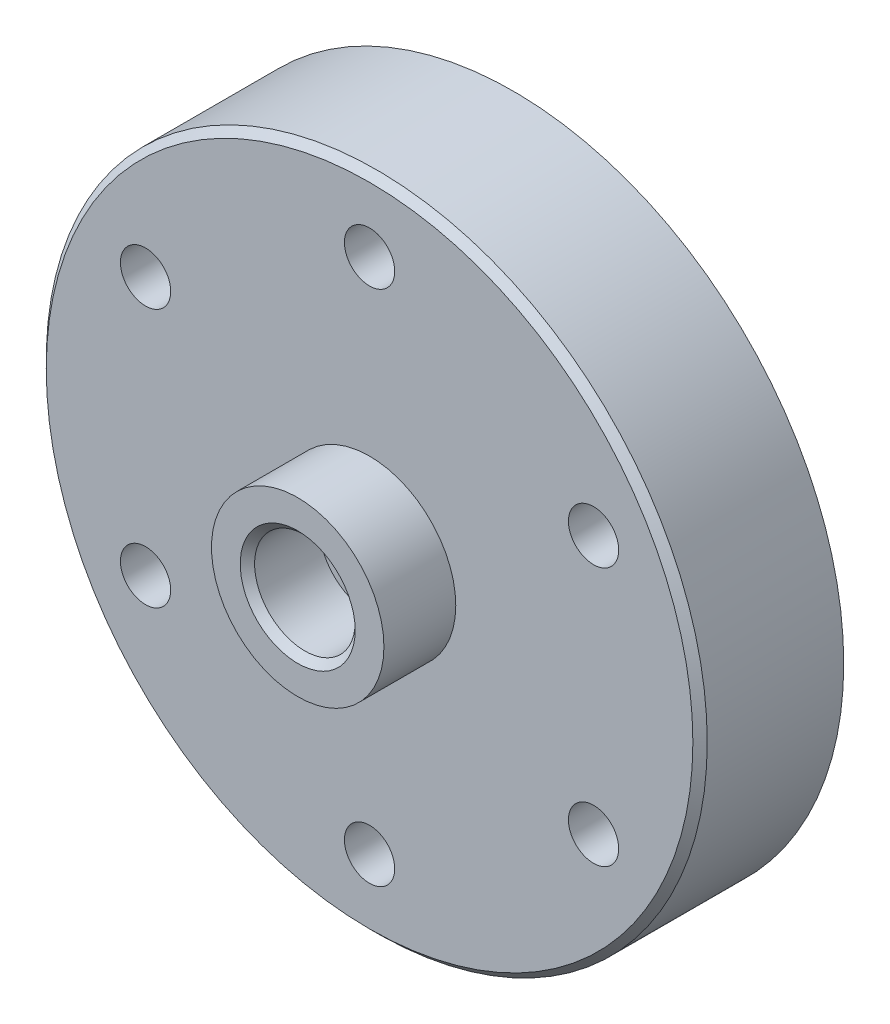
ISO-10303-21;
HEADER;
FILE_DESCRIPTION(('STEP AP214'),'2;1');
FILE_NAME('part.step','',(''),(''),'','','');
FILE_SCHEMA(('AUTOMOTIVE_DESIGN { 1 0 10303 214 1 1 1 1 }'));
ENDSEC;
DATA;
#1=APPLICATION_CONTEXT('core data for automotive mechanical design processes');
#2=APPLICATION_PROTOCOL_DEFINITION('international standard','automotive_design',2000,#1);
#3=PRODUCT_CONTEXT('',#1,'mechanical');
#4=PRODUCT('Part','Part','',(#3));
#5=PRODUCT_RELATED_PRODUCT_CATEGORY('part','',(#4));
#6=PRODUCT_DEFINITION_FORMATION('','',#4);
#7=PRODUCT_DEFINITION_CONTEXT('part definition',#1,'design');
#8=PRODUCT_DEFINITION('design','',#6,#7);
#9=PRODUCT_DEFINITION_SHAPE('','',#8);
#10=(LENGTH_UNIT() NAMED_UNIT(*) SI_UNIT(.MILLI.,.METRE.));
#11=(NAMED_UNIT(*) PLANE_ANGLE_UNIT() SI_UNIT($,.RADIAN.));
#12=(NAMED_UNIT(*) SI_UNIT($,.STERADIAN.) SOLID_ANGLE_UNIT());
#13=UNCERTAINTY_MEASURE_WITH_UNIT(LENGTH_MEASURE(1.E-05),#10,'distance_accuracy_value','');
#14=(GEOMETRIC_REPRESENTATION_CONTEXT(3) GLOBAL_UNCERTAINTY_ASSIGNED_CONTEXT((#13)) GLOBAL_UNIT_ASSIGNED_CONTEXT((#10,
#11,#12)) REPRESENTATION_CONTEXT('',''));
#15=CARTESIAN_POINT('',(0.,0.,0.));
#16=DIRECTION('',(0.,0.,1.));
#17=DIRECTION('',(1.,0.,0.));
#18=AXIS2_PLACEMENT_3D('',#15,#16,#17);
#19=CARTESIAN_POINT('',(0.,0.,20.));
#20=DIRECTION('',(0.,0.,1.));
#21=DIRECTION('',(1.,0.,0.));
#22=AXIS2_PLACEMENT_3D('',#19,#20,#21);
#23=PLANE('',#22);
#24=CARTESIAN_POINT('',(0.,0.,20.));
#25=DIRECTION('',(0.,0.,1.));
#26=DIRECTION('',(1.,0.,0.));
#27=AXIS2_PLACEMENT_3D('',#24,#25,#26);
#28=CIRCLE('',#27,12.);
#29=CARTESIAN_POINT('',(12.,0.,20.));
#30=VERTEX_POINT('',#29);
#31=EDGE_CURVE('E176',#30,#30,#28,.T.);
#32=ORIENTED_EDGE('',*,*,#31,.F.);
#33=EDGE_LOOP('',(#32));
#34=FACE_BOUND('',#33,.T.);
#35=CARTESIAN_POINT('',(0.,0.,20.));
#36=DIRECTION('',(0.,0.,1.));
#37=DIRECTION('',(1.,0.,0.));
#38=AXIS2_PLACEMENT_3D('',#35,#36,#37);
#39=CIRCLE('',#38,45.);
#40=CARTESIAN_POINT('',(45.,0.,20.));
#41=VERTEX_POINT('',#40);
#42=EDGE_CURVE('E209',#41,#41,#39,.T.);
#43=ORIENTED_EDGE('',*,*,#42,.T.);
#44=EDGE_LOOP('',(#43));
#45=FACE_BOUND('',#44,.T.);
#46=CARTESIAN_POINT('',(-31.1769145362373,-18.0000000000014,20.));
#47=DIRECTION('',(0.,0.,1.));
#48=DIRECTION('',(1.,0.,0.));
#49=AXIS2_PLACEMENT_3D('',#46,#47,#48);
#50=CIRCLE('',#49,3.5);
#51=CARTESIAN_POINT('',(-27.6769145362373,-18.0000000000014,20.));
#52=VERTEX_POINT('',#51);
#53=EDGE_CURVE('E180',#52,#52,#50,.T.);
#54=ORIENTED_EDGE('',*,*,#53,.F.);
#55=EDGE_LOOP('',(#54));
#56=FACE_BOUND('',#55,.T.);
#57=CARTESIAN_POINT('',(31.1769145362423,-17.9999999999986,20.));
#58=DIRECTION('',(0.,0.,1.));
#59=DIRECTION('',(1.,0.,0.));
#60=AXIS2_PLACEMENT_3D('',#57,#58,#59);
#61=CIRCLE('',#60,3.5);
#62=CARTESIAN_POINT('',(34.6769145362423,-17.9999999999986,20.));
#63=VERTEX_POINT('',#62);
#64=EDGE_CURVE('E191',#63,#63,#61,.T.);
#65=ORIENTED_EDGE('',*,*,#64,.F.);
#66=EDGE_LOOP('',(#65));
#67=FACE_BOUND('',#66,.T.);
#68=CARTESIAN_POINT('',(0.,36.,20.));
#69=DIRECTION('',(0.,0.,1.));
#70=DIRECTION('',(1.,0.,0.));
#71=AXIS2_PLACEMENT_3D('',#68,#69,#70);
#72=CIRCLE('',#71,3.5);
#73=CARTESIAN_POINT('',(3.5,36.,20.));
#74=VERTEX_POINT('',#73);
#75=EDGE_CURVE('E202',#74,#74,#72,.T.);
#76=ORIENTED_EDGE('',*,*,#75,.F.);
#77=EDGE_LOOP('',(#76));
#78=FACE_BOUND('',#77,.T.);
#79=CARTESIAN_POINT('',(31.1769145362406,18.0000000000014,20.));
#80=DIRECTION('',(0.,0.,1.));
#81=DIRECTION('',(1.,0.,0.));
#82=AXIS2_PLACEMENT_3D('',#79,#80,#81);
#83=CIRCLE('',#82,3.5);
#84=CARTESIAN_POINT('',(34.6769145362406,18.0000000000014,20.));
#85=VERTEX_POINT('',#84);
#86=EDGE_CURVE('E197',#85,#85,#83,.T.);
#87=ORIENTED_EDGE('',*,*,#86,.F.);
#88=EDGE_LOOP('',(#87));
#89=FACE_BOUND('',#88,.T.);
#90=CARTESIAN_POINT('',(3.3106442417675E-12,-36.,20.));
#91=DIRECTION('',(0.,0.,1.));
#92=DIRECTION('',(1.,0.,0.));
#93=AXIS2_PLACEMENT_3D('',#90,#91,#92);
#94=CIRCLE('',#93,3.5);
#95=CARTESIAN_POINT('',(3.50000000000331,-36.,20.));
#96=VERTEX_POINT('',#95);
#97=EDGE_CURVE('E185',#96,#96,#94,.T.);
#98=ORIENTED_EDGE('',*,*,#97,.F.);
#99=EDGE_LOOP('',(#98));
#100=FACE_BOUND('',#99,.T.);
#101=CARTESIAN_POINT('',(-31.176914536239,17.9999999999985,20.));
#102=DIRECTION('',(0.,0.,1.));
#103=DIRECTION('',(1.,0.,0.));
#104=AXIS2_PLACEMENT_3D('',#101,#102,#103);
#105=CIRCLE('',#104,3.5);
#106=CARTESIAN_POINT('',(-27.676914536239,17.9999999999985,20.));
#107=VERTEX_POINT('',#106);
#108=EDGE_CURVE('E169',#107,#107,#105,.T.);
#109=ORIENTED_EDGE('',*,*,#108,.F.);
#110=EDGE_LOOP('',(#109));
#111=FACE_BOUND('',#110,.T.);
#112=ADVANCED_FACE('F47',(#34,#45,#56,#67,#78,#89,#100,#111),#23,.T.);
#113=CARTESIAN_POINT('',(0.,0.,0.));
#114=DIRECTION('',(0.,0.,1.));
#115=DIRECTION('',(1.,0.,0.));
#116=AXIS2_PLACEMENT_3D('',#113,#114,#115);
#117=PLANE('',#116);
#118=CARTESIAN_POINT('',(0.,0.,0.));
#119=DIRECTION('',(0.,0.,1.));
#120=DIRECTION('',(1.,0.,0.));
#121=AXIS2_PLACEMENT_3D('',#118,#119,#120);
#122=CIRCLE('',#121,46.);
#123=CARTESIAN_POINT('',(46.,0.,0.));
#124=VERTEX_POINT('',#123);
#125=EDGE_CURVE('E205',#124,#124,#122,.T.);
#126=ORIENTED_EDGE('',*,*,#125,.F.);
#127=EDGE_LOOP('',(#126));
#128=FACE_BOUND('',#127,.T.);
#129=CARTESIAN_POINT('',(31.1769145362406,18.0000000000014,0.));
#130=DIRECTION('',(0.,0.,1.));
#131=DIRECTION('',(1.,0.,0.));
#132=AXIS2_PLACEMENT_3D('',#129,#130,#131);
#133=CIRCLE('',#132,3.5);
#134=CARTESIAN_POINT('',(29.4024648652408,14.9831592078666,0.));
#135=VERTEX_POINT('',#134);
#136=CARTESIAN_POINT('',(27.6770289355788,17.971701903246,0.));
#137=VERTEX_POINT('',#136);
#138=EDGE_CURVE('E194',#135,#137,#133,.T.);
#139=ORIENTED_EDGE('',*,*,#138,.T.);
#140=CARTESIAN_POINT('',(0.,0.,0.));
#141=DIRECTION('',(0.,0.,-1.));
#142=DIRECTION('',(-1.,0.,0.));
#143=AXIS2_PLACEMENT_3D('',#140,#141,#142);
#144=CIRCLE('',#143,33.);
#145=CARTESIAN_POINT('',(1.72543592966437,32.9548611111111,0.));
#146=VERTEX_POINT('',#145);
#147=EDGE_CURVE('E334',#146,#137,#144,.T.);
#148=ORIENTED_EDGE('',*,*,#147,.F.);
#149=CARTESIAN_POINT('',(0.,36.,0.));
#150=DIRECTION('',(0.,0.,1.));
#151=DIRECTION('',(1.,0.,0.));
#152=AXIS2_PLACEMENT_3D('',#149,#150,#151);
#153=CIRCLE('',#152,3.5);
#154=CARTESIAN_POINT('',(-1.72543592966437,32.9548611111111,0.));
#155=VERTEX_POINT('',#154);
#156=EDGE_CURVE('E200',#146,#155,#153,.T.);
#157=ORIENTED_EDGE('',*,*,#156,.T.);
#158=CARTESIAN_POINT('',(-27.6770289355772,17.9717019032485,0.));
#159=VERTEX_POINT('',#158);
#160=EDGE_CURVE('E155',#159,#155,#144,.T.);
#161=ORIENTED_EDGE('',*,*,#160,.F.);
#162=CARTESIAN_POINT('',(-31.176914536239,17.9999999999985,0.));
#163=DIRECTION('',(0.,0.,1.));
#164=DIRECTION('',(1.,0.,0.));
#165=AXIS2_PLACEMENT_3D('',#162,#163,#164);
#166=CIRCLE('',#165,3.5);
#167=CARTESIAN_POINT('',(-29.4024648652436,14.9831592078612,0.));
#168=VERTEX_POINT('',#167);
#169=EDGE_CURVE('E161',#159,#168,#166,.T.);
#170=ORIENTED_EDGE('',*,*,#169,.T.);
#171=CARTESIAN_POINT('',(-29.4024648652422,-14.9831592078639,0.));
#172=VERTEX_POINT('',#171);
#173=EDGE_CURVE('E141',#172,#168,#144,.T.);
#174=ORIENTED_EDGE('',*,*,#173,.F.);
#175=CARTESIAN_POINT('',(-31.1769145362373,-18.0000000000014,0.));
#176=DIRECTION('',(0.,0.,1.));
#177=DIRECTION('',(1.,0.,0.));
#178=AXIS2_PLACEMENT_3D('',#175,#176,#177);
#179=CIRCLE('',#178,3.5);
#180=CARTESIAN_POINT('',(-27.6770289355755,-17.971701903251,0.));
#181=VERTEX_POINT('',#180);
#182=EDGE_CURVE('E173',#172,#181,#179,.T.);
#183=ORIENTED_EDGE('',*,*,#182,.T.);
#184=CARTESIAN_POINT('',(-1.72543592966121,-32.9548611111113,0.));
#185=VERTEX_POINT('',#184);
#186=EDGE_CURVE('E152',#185,#181,#144,.T.);
#187=ORIENTED_EDGE('',*,*,#186,.F.);
#188=CARTESIAN_POINT('',(3.3106442417675E-12,-36.,0.));
#189=DIRECTION('',(0.,0.,1.));
#190=DIRECTION('',(1.,0.,0.));
#191=AXIS2_PLACEMENT_3D('',#188,#189,#190);
#192=CIRCLE('',#191,3.5);
#193=CARTESIAN_POINT('',(1.72543592966727,-32.954861111111,0.));
#194=VERTEX_POINT('',#193);
#195=EDGE_CURVE('E183',#185,#194,#192,.T.);
#196=ORIENTED_EDGE('',*,*,#195,.T.);
#197=CARTESIAN_POINT('',(27.6770289355805,-17.9717019032434,0.));
#198=VERTEX_POINT('',#197);
#199=EDGE_CURVE('E341',#198,#194,#144,.T.);
#200=ORIENTED_EDGE('',*,*,#199,.F.);
#201=CARTESIAN_POINT('',(31.1769145362423,-17.9999999999986,0.));
#202=DIRECTION('',(0.,0.,1.));
#203=DIRECTION('',(1.,0.,0.));
#204=AXIS2_PLACEMENT_3D('',#201,#202,#203);
#205=CIRCLE('',#204,3.5);
#206=CARTESIAN_POINT('',(29.4024648652422,-14.9831592078639,0.));
#207=VERTEX_POINT('',#206);
#208=EDGE_CURVE('E188',#198,#207,#205,.T.);
#209=ORIENTED_EDGE('',*,*,#208,.T.);
#210=EDGE_CURVE('E336',#135,#207,#144,.T.);
#211=ORIENTED_EDGE('',*,*,#210,.F.);
#212=EDGE_LOOP('',(#139,#148,#157,#161,#170,#174,#183,#187,#196,#200,#209,#211));
#213=FACE_BOUND('',#212,.T.);
#214=ADVANCED_FACE('F167',(#128,#213),#117,.F.);
#215=CARTESIAN_POINT('',(0.,0.,20.));
#216=DIRECTION('',(0.,0.,-1.));
#217=DIRECTION('',(-1.,0.,0.));
#218=AXIS2_PLACEMENT_3D('',#215,#216,#217);
#219=CYLINDRICAL_SURFACE('',#218,46.);
#220=CARTESIAN_POINT('',(-46.,0.,12.));
#221=CARTESIAN_POINT('',(-45.9999977285705,-0.22422738389411,11.9999902223244));
#222=CARTESIAN_POINT('',(-45.9983430362557,-0.448606525183141,11.9810823481538));
#223=CARTESIAN_POINT('',(-45.9919012379841,-0.891154156323271,11.905934927026));
#224=CARTESIAN_POINT('',(-45.9871106030481,-1.10931535995352,11.8496533211501));
#225=CARTESIAN_POINT('',(-45.9749381658736,-1.53295378380859,11.7014005001201));
#226=CARTESIAN_POINT('',(-45.9675578500262,-1.73843820070689,11.6094497546826));
#227=CARTESIAN_POINT('',(-45.9510332255131,-2.13100809888229,11.3925060672846));
#228=CARTESIAN_POINT('',(-45.9418892889027,-2.31809744825638,11.2675200924152));
#229=CARTESIAN_POINT('',(-45.9228348976703,-2.66913129878992,10.9876817198155));
#230=CARTESIAN_POINT('',(-45.9129226200477,-2.83301797480505,10.832756902906));
#231=CARTESIAN_POINT('',(-45.8934639727461,-3.13249799915954,10.4975919754114));
#232=CARTESIAN_POINT('',(-45.883917619324,-3.26809009164363,10.3173507417508));
#233=CARTESIAN_POINT('',(-45.8662523263715,-3.50732983244712,9.93631649648541));
#234=CARTESIAN_POINT('',(-45.8581356821084,-3.61092631199781,9.7354912420483));
#235=CARTESIAN_POINT('',(-45.8442700926442,-3.78290727978104,9.31921411480216));
#236=CARTESIAN_POINT('',(-45.8385211022726,-3.85129243978993,9.10376252112935));
#237=CARTESIAN_POINT('',(-45.830057344427,-3.95074097738121,8.66493046722142));
#238=CARTESIAN_POINT('',(-45.8273348860433,-3.98189897039565,8.44157159960639));
#239=CARTESIAN_POINT('',(-45.8252082353394,-4.0063010444028,7.99277909240269));
#240=CARTESIAN_POINT('',(-45.8258039757165,-3.99954589438519,7.76734549498822));
#241=CARTESIAN_POINT('',(-45.8302394140666,-3.9483915880778,7.32145192507496));
#242=CARTESIAN_POINT('',(-45.8340702424775,-3.90409535607296,7.10098004420689));
#243=CARTESIAN_POINT('',(-45.8445303189289,-3.77927624600677,6.67061226769208));
#244=CARTESIAN_POINT('',(-45.8511595964273,-3.69875298659973,6.46071648340103));
#245=CARTESIAN_POINT('',(-45.866479827065,-3.50365067255338,6.05713164951169));
#246=CARTESIAN_POINT('',(-45.8751735661868,-3.38902554426596,5.86346498303699));
#247=CARTESIAN_POINT('',(-45.8936406284605,-3.12900647092458,5.49808067860247));
#248=CARTESIAN_POINT('',(-45.9034139754438,-2.98361184659911,5.3263635253373));
#249=CARTESIAN_POINT('',(-45.9229785147518,-2.66560421524801,5.00915428882337));
#250=CARTESIAN_POINT('',(-45.9327696582409,-2.4929022472207,4.86375137254269));
#251=CARTESIAN_POINT('',(-45.95123564835,-2.12549237013378,4.60398782752038));
#252=CARTESIAN_POINT('',(-45.959910494134,-1.93078444459427,4.48962722202606));
#253=CARTESIAN_POINT('',(-45.9751683502548,-1.52483096588586,4.29519972840698));
#254=CARTESIAN_POINT('',(-45.9817511125928,-1.31358345578604,4.21513690560241));
#255=CARTESIAN_POINT('',(-45.9920803344126,-0.880574461427621,4.09164068539058));
#256=CARTESIAN_POINT('',(-45.995826857993,-0.65881321489861,4.04820646017872));
#257=CARTESIAN_POINT('',(-46.0000532442106,-0.211844479152889,3.99931243567537));
#258=CARTESIAN_POINT('',(-46.0005436994455,0.0133494440173144,3.99372949782599));
#259=CARTESIAN_POINT('',(-45.9982310016282,0.461469996673727,4.02037377739986));
#260=CARTESIAN_POINT('',(-45.9954278820702,0.684396649193822,4.05260061031447));
#261=CARTESIAN_POINT('',(-45.9868500316988,1.12130261089924,4.15384754873136));
#262=CARTESIAN_POINT('',(-45.9810799206281,1.33529527230571,4.22281046045096));
#263=CARTESIAN_POINT('',(-45.967216103292,1.74867267660003,4.39551346360269));
#264=CARTESIAN_POINT('',(-45.9591223571432,1.9480571686755,4.49925415197528));
#265=CARTESIAN_POINT('',(-45.9414917704405,2.32711808841676,4.73887651706901));
#266=CARTESIAN_POINT('',(-45.9319512956969,2.50674286157891,4.87483963498195));
#267=CARTESIAN_POINT('',(-45.9125109361372,2.84066374135941,5.17492989696734));
#268=CARTESIAN_POINT('',(-45.9026110445232,2.99495936860324,5.33905757395657));
#269=CARTESIAN_POINT('',(-45.8835361672919,3.27426550151283,5.69135291706405));
#270=CARTESIAN_POINT('',(-45.8743632176725,3.39919555788599,5.87958449040561));
#271=CARTESIAN_POINT('',(-45.8578101371487,3.61567234236893,6.2744269056061));
#272=CARTESIAN_POINT('',(-45.8504299869865,3.70721942907557,6.48103755000905));
#273=CARTESIAN_POINT('',(-45.8383098416306,3.85419502490979,6.90649014364956));
#274=CARTESIAN_POINT('',(-45.8335662683104,3.90967250193944,7.12531507047241));
#275=CARTESIAN_POINT('',(-45.8272445862578,3.98309339935581,7.56921703354049));
#276=CARTESIAN_POINT('',(-45.825666410717,4.00103761191455,7.79429393773074));
#277=CARTESIAN_POINT('',(-45.8258552825946,3.99887309501891,8.2435112367157));
#278=CARTESIAN_POINT('',(-45.8276112185648,3.97889076180226,8.46765225602455));
#279=CARTESIAN_POINT('',(-45.834246839158,3.90170423350695,8.90938170140372));
#280=CARTESIAN_POINT('',(-45.8391265283207,3.84449998433456,9.12697011795083));
#281=CARTESIAN_POINT('',(-45.8514568827458,3.69452606310881,9.54942414597572));
#282=CARTESIAN_POINT('',(-45.8589073615243,3.6017589707124,9.75429067902108));
#283=CARTESIAN_POINT('',(-45.8755401471554,3.38330655214035,10.1455631184226));
#284=CARTESIAN_POINT('',(-45.8847224303796,3.25762167508082,10.3319692765964));
#285=CARTESIAN_POINT('',(-45.9038206784499,2.97642627183586,10.6816767736096));
#286=CARTESIAN_POINT('',(-45.9137388879215,2.82082198308656,10.8449025967924));
#287=CARTESIAN_POINT('',(-45.93317092391,2.48437904881077,11.1429886856669));
#288=CARTESIAN_POINT('',(-45.9426846522082,2.303534319391,11.2778420928329));
#289=CARTESIAN_POINT('',(-45.9602544666636,1.92136583977714,11.5155531499808));
#290=CARTESIAN_POINT('',(-45.9683076119567,1.72000201971635,11.6183465404037));
#291=CARTESIAN_POINT('',(-45.9820150223571,1.30293824908928,11.7885308261092));
#292=CARTESIAN_POINT('',(-45.9876720328809,1.08725503492918,11.8559622592335));
#293=CARTESIAN_POINT('',(-45.994503746574,0.725257992711598,11.9364074005984));
#294=CARTESIAN_POINT('',(-45.9965554127388,0.581269530602112,11.9602227509663));
#295=CARTESIAN_POINT('',(-45.9993042759584,0.291542097632153,11.9920222063787));
#296=CARTESIAN_POINT('',(-46.0000014769897,0.145803131912244,12.000006357902));
#297=CARTESIAN_POINT('',(-46.,0.,12.));
#298=B_SPLINE_CURVE_WITH_KNOTS('',3,(#220,#221,#222,#223,#224,#225,#226,#227,#228,#229,#230,
#231,#232,#233,#234,#235,#236,#237,#238,#239,#240,#241,#242,#243,#244,#245,#246,#247,#248,#249,
#250,#251,#252,#253,#254,#255,#256,#257,#258,#259,#260,#261,#262,#263,#264,#265,#266,#267,#268,
#269,#270,#271,#272,#273,#274,#275,#276,#277,#278,#279,#280,#281,#282,#283,#284,#285,#286,#287,
#288,#289,#290,#291,#292,#293,#294,#295,#296,#297),.UNSPECIFIED.,.T.,.F.,(4,2,2,2,2,2,2,2,2,2,2,
2,2,2,2,2,2,2,2,2,2,2,2,2,2,2,2,2,2,2,2,2,2,2,2,2,2,2,4),(0.,0.672149795371174,1.34505728632151,
2.01757918073403,2.68995935408334,3.36398678235651,4.03804412098098,4.71317392514569,
5.38829084842312,6.06168824011353,6.73507197338012,7.40661547829384,8.07816605241074,
8.75062808366532,9.42310496183093,10.0978195498406,10.7725346431367,11.4473296883784,
12.1221094828746,12.7946930125715,13.4672697024505,14.1388023163357,14.8103464572807,
15.4836063550193,16.1568789932759,16.8319751599037,17.507064074496,18.1812345677475,
18.855390831904,19.5273043074988,20.1992187595716,20.8710844815444,21.5429410373477,
22.2169384480893,22.8910985989687,23.5666014469276,24.2413282173606,24.6783927333046,
25.11545596607),.UNSPECIFIED.);
#299=CARTESIAN_POINT('',(-46.,0.,12.));
#300=VERTEX_POINT('',#299);
#301=EDGE_CURVE('E258',#300,#300,#298,.T.);
#302=ORIENTED_EDGE('',*,*,#301,.T.);
#303=EDGE_LOOP('',(#302));
#304=FACE_BOUND('',#303,.T.);
#305=CARTESIAN_POINT('',(0.,0.,19.));
#306=DIRECTION('',(0.,0.,1.));
#307=DIRECTION('',(1.,0.,0.));
#308=AXIS2_PLACEMENT_3D('',#305,#306,#307);
#309=CIRCLE('',#308,46.);
#310=CARTESIAN_POINT('',(46.,0.,19.));
#311=VERTEX_POINT('',#310);
#312=EDGE_CURVE('E212',#311,#311,#309,.F.);
#313=ORIENTED_EDGE('',*,*,#312,.T.);
#314=EDGE_LOOP('',(#313));
#315=FACE_BOUND('',#314,.T.);
#316=ORIENTED_EDGE('',*,*,#125,.T.);
#317=EDGE_LOOP('',(#316));
#318=FACE_BOUND('',#317,.T.);
#319=ADVANCED_FACE('F244',(#304,#315,#318),#219,.T.);
#320=CARTESIAN_POINT('',(0.,36.,20.));
#321=DIRECTION('',(0.,0.,-1.));
#322=DIRECTION('',(-1.,0.,0.));
#323=AXIS2_PLACEMENT_3D('',#320,#321,#322);
#324=CYLINDRICAL_SURFACE('',#323,3.5);
#325=DIRECTION('',(0.,0.,-1.));
#326=VECTOR('',#325,1.);
#327=CARTESIAN_POINT('',(-1.72543592966432,32.9548611111111,7.));
#328=LINE('',#327,#326);
#329=CARTESIAN_POINT('',(-1.72543592966437,32.9548611111111,14.));
#330=VERTEX_POINT('',#329);
#331=EDGE_CURVE('E370',#155,#330,#328,.F.);
#332=ORIENTED_EDGE('',*,*,#331,.F.);
#333=ORIENTED_EDGE('',*,*,#156,.F.);
#334=DIRECTION('',(0.,0.,-1.));
#335=VECTOR('',#334,1.);
#336=CARTESIAN_POINT('',(1.72543592966432,32.9548611111111,7.));
#337=LINE('',#336,#335);
#338=CARTESIAN_POINT('',(1.72543592966437,32.9548611111111,14.));
#339=VERTEX_POINT('',#338);
#340=EDGE_CURVE('E329',#339,#146,#337,.T.);
#341=ORIENTED_EDGE('',*,*,#340,.F.);
#342=CARTESIAN_POINT('',(0.,36.,14.));
#343=DIRECTION('',(0.,0.,-1.));
#344=DIRECTION('',(-1.,0.,0.));
#345=AXIS2_PLACEMENT_3D('',#342,#343,#344);
#346=CIRCLE('',#345,3.5);
#347=EDGE_CURVE('E354',#339,#330,#346,.T.);
#348=ORIENTED_EDGE('',*,*,#347,.T.);
#349=EDGE_LOOP('',(#332,#333,#341,#348));
#350=FACE_BOUND('',#349,.T.);
#351=ORIENTED_EDGE('',*,*,#75,.T.);
#352=EDGE_LOOP('',(#351));
#353=FACE_BOUND('',#352,.T.);
#354=ADVANCED_FACE('F250',(#350,#353),#324,.F.);
#355=CARTESIAN_POINT('',(31.1769145362406,18.0000000000014,20.));
#356=DIRECTION('',(0.,0.,-1.));
#357=DIRECTION('',(-1.,0.,0.));
#358=AXIS2_PLACEMENT_3D('',#355,#356,#357);
#359=CYLINDRICAL_SURFACE('',#358,3.5);
#360=DIRECTION('',(0.,0.,-1.));
#361=VECTOR('',#360,1.);
#362=CARTESIAN_POINT('',(27.6770289355788,17.971701903246,7.));
#363=LINE('',#362,#361);
#364=CARTESIAN_POINT('',(27.6770289355788,17.971701903246,14.));
#365=VERTEX_POINT('',#364);
#366=EDGE_CURVE('E316',#137,#365,#363,.F.);
#367=ORIENTED_EDGE('',*,*,#366,.F.);
#368=ORIENTED_EDGE('',*,*,#138,.F.);
#369=DIRECTION('',(0.,0.,-1.));
#370=VECTOR('',#369,1.);
#371=CARTESIAN_POINT('',(29.4024648652409,14.9831592078666,7.));
#372=LINE('',#371,#370);
#373=CARTESIAN_POINT('',(29.4024648652408,14.9831592078666,14.));
#374=VERTEX_POINT('',#373);
#375=EDGE_CURVE('E330',#374,#135,#372,.T.);
#376=ORIENTED_EDGE('',*,*,#375,.F.);
#377=CARTESIAN_POINT('',(31.1769145362406,18.0000000000014,14.));
#378=DIRECTION('',(0.,0.,-1.));
#379=DIRECTION('',(-1.,0.,0.));
#380=AXIS2_PLACEMENT_3D('',#377,#378,#379);
#381=CIRCLE('',#380,3.5);
#382=EDGE_CURVE('E325',#374,#365,#381,.T.);
#383=ORIENTED_EDGE('',*,*,#382,.T.);
#384=EDGE_LOOP('',(#367,#368,#376,#383));
#385=FACE_BOUND('',#384,.T.);
#386=ORIENTED_EDGE('',*,*,#86,.T.);
#387=EDGE_LOOP('',(#386));
#388=FACE_BOUND('',#387,.T.);
#389=ADVANCED_FACE('F304',(#385,#388),#359,.F.);
#390=CARTESIAN_POINT('',(31.1769145362423,-17.9999999999986,20.));
#391=DIRECTION('',(0.,0.,-1.));
#392=DIRECTION('',(-1.,0.,0.));
#393=AXIS2_PLACEMENT_3D('',#390,#391,#392);
#394=CYLINDRICAL_SURFACE('',#393,3.5);
#395=DIRECTION('',(0.,0.,-1.));
#396=VECTOR('',#395,1.);
#397=CARTESIAN_POINT('',(29.4024648652422,-14.9831592078639,7.));
#398=LINE('',#397,#396);
#399=CARTESIAN_POINT('',(29.4024648652422,-14.9831592078639,14.));
#400=VERTEX_POINT('',#399);
#401=EDGE_CURVE('E366',#207,#400,#398,.F.);
#402=ORIENTED_EDGE('',*,*,#401,.F.);
#403=ORIENTED_EDGE('',*,*,#208,.F.);
#404=DIRECTION('',(0.,0.,-1.));
#405=VECTOR('',#404,1.);
#406=CARTESIAN_POINT('',(27.6770289355804,-17.9717019032434,7.));
#407=LINE('',#406,#405);
#408=CARTESIAN_POINT('',(27.6770289355805,-17.9717019032434,14.));
#409=VERTEX_POINT('',#408);
#410=EDGE_CURVE('E364',#409,#198,#407,.T.);
#411=ORIENTED_EDGE('',*,*,#410,.F.);
#412=CARTESIAN_POINT('',(31.1769145362423,-17.9999999999986,14.));
#413=DIRECTION('',(0.,0.,-1.));
#414=DIRECTION('',(-1.,0.,0.));
#415=AXIS2_PLACEMENT_3D('',#412,#413,#414);
#416=CIRCLE('',#415,3.5);
#417=EDGE_CURVE('E350',#409,#400,#416,.T.);
#418=ORIENTED_EDGE('',*,*,#417,.T.);
#419=EDGE_LOOP('',(#402,#403,#411,#418));
#420=FACE_BOUND('',#419,.T.);
#421=ORIENTED_EDGE('',*,*,#64,.T.);
#422=EDGE_LOOP('',(#421));
#423=FACE_BOUND('',#422,.T.);
#424=ADVANCED_FACE('F301',(#420,#423),#394,.F.);
#425=CARTESIAN_POINT('',(3.3106442417675E-12,-36.,20.));
#426=DIRECTION('',(0.,0.,-1.));
#427=DIRECTION('',(-1.,0.,0.));
#428=AXIS2_PLACEMENT_3D('',#425,#426,#427);
#429=CYLINDRICAL_SURFACE('',#428,3.5);
#430=DIRECTION('',(0.,0.,-1.));
#431=VECTOR('',#430,1.);
#432=CARTESIAN_POINT('',(1.72543592966735,-32.954861111111,7.));
#433=LINE('',#432,#431);
#434=CARTESIAN_POINT('',(1.72543592966727,-32.954861111111,14.));
#435=VERTEX_POINT('',#434);
#436=EDGE_CURVE('E362',#194,#435,#433,.F.);
#437=ORIENTED_EDGE('',*,*,#436,.F.);
#438=ORIENTED_EDGE('',*,*,#195,.F.);
#439=DIRECTION('',(0.,0.,-1.));
#440=VECTOR('',#439,1.);
#441=CARTESIAN_POINT('',(-1.72543592966129,-32.9548611111113,7.));
#442=LINE('',#441,#440);
#443=CARTESIAN_POINT('',(-1.72543592966121,-32.9548611111113,14.));
#444=VERTEX_POINT('',#443);
#445=EDGE_CURVE('E360',#444,#185,#442,.T.);
#446=ORIENTED_EDGE('',*,*,#445,.F.);
#447=CARTESIAN_POINT('',(3.3106442417675E-12,-36.,14.));
#448=DIRECTION('',(0.,0.,-1.));
#449=DIRECTION('',(-1.,0.,0.));
#450=AXIS2_PLACEMENT_3D('',#447,#448,#449);
#451=CIRCLE('',#450,3.5);
#452=EDGE_CURVE('E346',#444,#435,#451,.T.);
#453=ORIENTED_EDGE('',*,*,#452,.T.);
#454=EDGE_LOOP('',(#437,#438,#446,#453));
#455=FACE_BOUND('',#454,.T.);
#456=ORIENTED_EDGE('',*,*,#97,.T.);
#457=EDGE_LOOP('',(#456));
#458=FACE_BOUND('',#457,.T.);
#459=ADVANCED_FACE('F297',(#455,#458),#429,.F.);
#460=CARTESIAN_POINT('',(-31.1769145362373,-18.0000000000014,20.));
#461=DIRECTION('',(0.,0.,-1.));
#462=DIRECTION('',(-1.,0.,0.));
#463=AXIS2_PLACEMENT_3D('',#460,#461,#462);
#464=CYLINDRICAL_SURFACE('',#463,3.5);
#465=DIRECTION('',(0.,0.,-1.));
#466=VECTOR('',#465,1.);
#467=CARTESIAN_POINT('',(-27.6770289355754,-17.9717019032511,7.));
#468=LINE('',#467,#466);
#469=CARTESIAN_POINT('',(-27.6770289355755,-17.971701903251,14.));
#470=VERTEX_POINT('',#469);
#471=EDGE_CURVE('E358',#181,#470,#468,.F.);
#472=ORIENTED_EDGE('',*,*,#471,.F.);
#473=ORIENTED_EDGE('',*,*,#182,.F.);
#474=DIRECTION('',(0.,0.,-1.));
#475=VECTOR('',#474,1.);
#476=CARTESIAN_POINT('',(-29.4024648652423,-14.9831592078638,7.));
#477=LINE('',#476,#475);
#478=CARTESIAN_POINT('',(-29.4024648652422,-14.9831592078639,14.));
#479=VERTEX_POINT('',#478);
#480=EDGE_CURVE('E147',#479,#172,#477,.T.);
#481=ORIENTED_EDGE('',*,*,#480,.F.);
#482=CARTESIAN_POINT('',(-31.1769145362373,-18.0000000000014,14.));
#483=DIRECTION('',(0.,0.,-1.));
#484=DIRECTION('',(-1.,0.,0.));
#485=AXIS2_PLACEMENT_3D('',#482,#483,#484);
#486=CIRCLE('',#485,3.5);
#487=EDGE_CURVE('E74',#479,#470,#486,.T.);
#488=ORIENTED_EDGE('',*,*,#487,.T.);
#489=EDGE_LOOP('',(#472,#473,#481,#488));
#490=FACE_BOUND('',#489,.T.);
#491=ORIENTED_EDGE('',*,*,#53,.T.);
#492=EDGE_LOOP('',(#491));
#493=FACE_BOUND('',#492,.T.);
#494=ADVANCED_FACE('F294',(#490,#493),#464,.F.);
#495=CARTESIAN_POINT('',(-31.176914536239,17.9999999999985,20.));
#496=DIRECTION('',(0.,0.,-1.));
#497=DIRECTION('',(-1.,0.,0.));
#498=AXIS2_PLACEMENT_3D('',#495,#496,#497);
#499=CYLINDRICAL_SURFACE('',#498,3.5);
#500=DIRECTION('',(0.,0.,-1.));
#501=VECTOR('',#500,1.);
#502=CARTESIAN_POINT('',(-29.4024648652437,14.9831592078611,7.));
#503=LINE('',#502,#501);
#504=CARTESIAN_POINT('',(-29.4024648652436,14.9831592078612,14.));
#505=VERTEX_POINT('',#504);
#506=EDGE_CURVE('E144',#168,#505,#503,.F.);
#507=ORIENTED_EDGE('',*,*,#506,.F.);
#508=ORIENTED_EDGE('',*,*,#169,.F.);
#509=DIRECTION('',(0.,0.,-1.));
#510=VECTOR('',#509,1.);
#511=CARTESIAN_POINT('',(-27.6770289355771,17.9717019032486,7.));
#512=LINE('',#511,#510);
#513=CARTESIAN_POINT('',(-27.6770289355772,17.9717019032485,14.));
#514=VERTEX_POINT('',#513);
#515=EDGE_CURVE('E163',#514,#159,#512,.T.);
#516=ORIENTED_EDGE('',*,*,#515,.F.);
#517=CARTESIAN_POINT('',(-31.176914536239,17.9999999999985,14.));
#518=DIRECTION('',(0.,0.,-1.));
#519=DIRECTION('',(-1.,0.,0.));
#520=AXIS2_PLACEMENT_3D('',#517,#518,#519);
#521=CIRCLE('',#520,3.5);
#522=EDGE_CURVE('E162',#514,#505,#521,.T.);
#523=ORIENTED_EDGE('',*,*,#522,.T.);
#524=EDGE_LOOP('',(#507,#508,#516,#523));
#525=FACE_BOUND('',#524,.T.);
#526=ORIENTED_EDGE('',*,*,#108,.T.);
#527=EDGE_LOOP('',(#526));
#528=FACE_BOUND('',#527,.T.);
#529=ADVANCED_FACE('F158',(#525,#528),#499,.F.);
#530=CARTESIAN_POINT('',(0.,0.,20.));
#531=DIRECTION('',(0.,0.,-1.));
#532=DIRECTION('',(-1.,0.,0.));
#533=AXIS2_PLACEMENT_3D('',#530,#531,#532);
#534=CONICAL_SURFACE('',#533,45.,0.785398163397445);
#535=ORIENTED_EDGE('',*,*,#312,.F.);
#536=EDGE_LOOP('',(#535));
#537=FACE_BOUND('',#536,.T.);
#538=ORIENTED_EDGE('',*,*,#42,.F.);
#539=EDGE_LOOP('',(#538));
#540=FACE_BOUND('',#539,.T.);
#541=ADVANCED_FACE('F256',(#537,#540),#534,.T.);
#542=CARTESIAN_POINT('',(0.,0.,30.));
#543=DIRECTION('',(0.,0.,-1.));
#544=DIRECTION('',(-1.,0.,0.));
#545=AXIS2_PLACEMENT_3D('',#542,#543,#544);
#546=CYLINDRICAL_SURFACE('',#545,12.);
#547=CARTESIAN_POINT('',(0.,0.,30.));
#548=DIRECTION('',(0.,0.,1.));
#549=DIRECTION('',(1.,0.,0.));
#550=AXIS2_PLACEMENT_3D('',#547,#548,#549);
#551=CIRCLE('',#550,12.);
#552=CARTESIAN_POINT('',(12.,0.,30.));
#553=VERTEX_POINT('',#552);
#554=EDGE_CURVE('E170',#553,#553,#551,.T.);
#555=ORIENTED_EDGE('',*,*,#554,.F.);
#556=EDGE_LOOP('',(#555));
#557=FACE_BOUND('',#556,.T.);
#558=ORIENTED_EDGE('',*,*,#31,.T.);
#559=EDGE_LOOP('',(#558));
#560=FACE_BOUND('',#559,.T.);
#561=ADVANCED_FACE('F288',(#557,#560),#546,.T.);
#562=CARTESIAN_POINT('',(0.,0.,30.));
#563=DIRECTION('',(0.,0.,1.));
#564=DIRECTION('',(1.,0.,0.));
#565=AXIS2_PLACEMENT_3D('',#562,#563,#564);
#566=PLANE('',#565);
#567=CARTESIAN_POINT('',(0.,0.,30.));
#568=DIRECTION('',(0.,0.,1.));
#569=DIRECTION('',(1.,0.,0.));
#570=AXIS2_PLACEMENT_3D('',#567,#568,#569);
#571=CIRCLE('',#570,8.00000000000001);
#572=CARTESIAN_POINT('',(8.00000000000001,0.,30.));
#573=VERTEX_POINT('',#572);
#574=EDGE_CURVE('E11',#573,#573,#571,.F.);
#575=ORIENTED_EDGE('',*,*,#574,.T.);
#576=EDGE_LOOP('',(#575));
#577=FACE_BOUND('',#576,.T.);
#578=ORIENTED_EDGE('',*,*,#554,.T.);
#579=EDGE_LOOP('',(#578));
#580=FACE_BOUND('',#579,.T.);
#581=ADVANCED_FACE('F285',(#577,#580),#566,.T.);
#582=CARTESIAN_POINT('',(0.,0.,14.));
#583=DIRECTION('',(0.,0.,-1.));
#584=DIRECTION('',(-1.,0.,0.));
#585=AXIS2_PLACEMENT_3D('',#582,#583,#584);
#586=CYLINDRICAL_SURFACE('',#585,33.);
#587=ORIENTED_EDGE('',*,*,#331,.T.);
#588=CARTESIAN_POINT('',(0.,0.,14.));
#589=DIRECTION('',(0.,0.,-1.));
#590=DIRECTION('',(-1.,0.,0.));
#591=AXIS2_PLACEMENT_3D('',#588,#589,#590);
#592=CIRCLE('',#591,33.);
#593=EDGE_CURVE('E347',#514,#330,#592,.T.);
#594=ORIENTED_EDGE('',*,*,#593,.F.);
#595=ORIENTED_EDGE('',*,*,#515,.T.);
#596=ORIENTED_EDGE('',*,*,#160,.T.);
#597=EDGE_LOOP('',(#587,#594,#595,#596));
#598=FACE_BOUND('',#597,.T.);
#599=ADVANCED_FACE('F284',(#598),#586,.F.);
#600=ORIENTED_EDGE('',*,*,#340,.T.);
#601=ORIENTED_EDGE('',*,*,#147,.T.);
#602=ORIENTED_EDGE('',*,*,#366,.T.);
#603=EDGE_CURVE('E377',#339,#365,#592,.T.);
#604=ORIENTED_EDGE('',*,*,#603,.F.);
#605=EDGE_LOOP('',(#600,#601,#602,#604));
#606=FACE_BOUND('',#605,.T.);
#607=ADVANCED_FACE('F380',(#606),#586,.F.);
#608=ORIENTED_EDGE('',*,*,#375,.T.);
#609=ORIENTED_EDGE('',*,*,#210,.T.);
#610=ORIENTED_EDGE('',*,*,#401,.T.);
#611=EDGE_CURVE('E381',#374,#400,#592,.T.);
#612=ORIENTED_EDGE('',*,*,#611,.F.);
#613=EDGE_LOOP('',(#608,#609,#610,#612));
#614=FACE_BOUND('',#613,.T.);
#615=ADVANCED_FACE('F400',(#614),#586,.F.);
#616=ORIENTED_EDGE('',*,*,#410,.T.);
#617=ORIENTED_EDGE('',*,*,#199,.T.);
#618=ORIENTED_EDGE('',*,*,#436,.T.);
#619=EDGE_CURVE('E383',#409,#435,#592,.T.);
#620=ORIENTED_EDGE('',*,*,#619,.F.);
#621=EDGE_LOOP('',(#616,#617,#618,#620));
#622=FACE_BOUND('',#621,.T.);
#623=ADVANCED_FACE('F397',(#622),#586,.F.);
#624=ORIENTED_EDGE('',*,*,#445,.T.);
#625=ORIENTED_EDGE('',*,*,#186,.T.);
#626=ORIENTED_EDGE('',*,*,#471,.T.);
#627=EDGE_CURVE('E386',#444,#470,#592,.T.);
#628=ORIENTED_EDGE('',*,*,#627,.F.);
#629=EDGE_LOOP('',(#624,#625,#626,#628));
#630=FACE_BOUND('',#629,.T.);
#631=ADVANCED_FACE('F282',(#630),#586,.F.);
#632=CARTESIAN_POINT('',(-33.,0.,4.));
#633=CARTESIAN_POINT('',(-32.9999969558129,-0.223801305491505,4.00000954100904));
#634=CARTESIAN_POINT('',(-32.9976992481914,-0.447743808064033,4.01884594800692));
#635=CARTESIAN_POINT('',(-32.9887542393864,-0.889401067379154,4.09369287966306));
#636=CARTESIAN_POINT('',(-32.9821023551355,-1.10710900952551,4.14974257473052));
#637=CARTESIAN_POINT('',(-32.9651986138428,-1.52983902053619,4.2973437403298));
#638=CARTESIAN_POINT('',(-32.9549491394049,-1.73486938003849,4.38887171855982));
#639=CARTESIAN_POINT('',(-32.9319911781194,-2.12661939719003,4.60478084350221));
#640=CARTESIAN_POINT('',(-32.9192831242503,-2.31334227024487,4.72915620689305));
#641=CARTESIAN_POINT('',(-32.8927538711825,-2.66418599736213,5.00792008383687));
#642=CARTESIAN_POINT('',(-32.878927789439,-2.82819817435391,5.16244492403606));
#643=CARTESIAN_POINT('',(-32.8517602971756,-3.12802913113998,5.49682888137466));
#644=CARTESIAN_POINT('',(-32.8384189109904,-3.2638464969901,5.67668926830987));
#645=CARTESIAN_POINT('',(-32.8136830857066,-3.50383433976517,6.05734113830005));
#646=CARTESIAN_POINT('',(-32.8022949283727,-3.60790351727114,6.25819693047698));
#647=CARTESIAN_POINT('',(-32.7828188539988,-3.780793946818,6.67469534652229));
#648=CARTESIAN_POINT('',(-32.7747308191154,-3.84961645749954,6.89033744206741));
#649=CARTESIAN_POINT('',(-32.7628170518708,-3.94973087788411,7.32916196064259));
#650=CARTESIAN_POINT('',(-32.7589705374767,-3.98120583640232,7.55230204850896));
#651=CARTESIAN_POINT('',(-32.7559116064256,-4.00629801514827,8.00072790580982));
#652=CARTESIAN_POINT('',(-32.756699014156,-3.99991667002376,8.22601359360906));
#653=CARTESIAN_POINT('',(-32.762799944861,-3.94962774321501,8.67106222866994));
#654=CARTESIAN_POINT('',(-32.768089183279,-3.90592150171733,8.89084830679435));
#655=CARTESIAN_POINT('',(-32.7825599300818,-3.78253743967911,9.31994320453687));
#656=CARTESIAN_POINT('',(-32.7917415130163,-3.70285893016408,9.52925182339559));
#657=CARTESIAN_POINT('',(-32.8129900264165,-3.50957474054861,9.93207752991913));
#658=CARTESIAN_POINT('',(-32.8250644072638,-3.3958812638873,10.1255520819421));
#659=CARTESIAN_POINT('',(-32.850732200003,-3.13785733178003,10.4907516303237));
#660=CARTESIAN_POINT('',(-32.8643256772326,-2.99352555831389,10.6624756904965));
#661=CARTESIAN_POINT('',(-32.8916080277259,-2.67720480655516,10.980468505869));
#662=CARTESIAN_POINT('',(-32.9052969469684,-2.50504222708054,11.1265646242462));
#663=CARTESIAN_POINT('',(-32.9311450368864,-2.13854549445852,11.3878112531788));
#664=CARTESIAN_POINT('',(-32.9433042043832,-1.94421129524354,11.5029616994345));
#665=CARTESIAN_POINT('',(-32.9647296973872,-1.53875686094017,11.6990472443189));
#666=CARTESIAN_POINT('',(-32.9739951374587,-1.32763151276492,11.7799718730552));
#667=CARTESIAN_POINT('',(-32.9885810461424,-0.894651824892179,11.9051733284115));
#668=CARTESIAN_POINT('',(-32.9939016883567,-0.672797957791595,11.9494517677617));
#669=CARTESIAN_POINT('',(-32.9999759911712,-0.226151933486935,11.999880976652));
#670=CARTESIAN_POINT('',(-33.0007581450581,-0.00138700690903849,12.0062696293693));
#671=CARTESIAN_POINT('',(-32.9977441874559,0.44601029158477,11.9813651979617));
#672=CARTESIAN_POINT('',(-32.9939481675208,0.668642706056812,11.9500728673792));
#673=CARTESIAN_POINT('',(-32.9822222101791,1.10475588230675,11.8508923229622));
#674=CARTESIAN_POINT('',(-32.9743050498401,1.31826273527194,11.7831171973245));
#675=CARTESIAN_POINT('',(-32.9552234751977,1.73087951773984,11.6130122986461));
#676=CARTESIAN_POINT('',(-32.9440589566637,1.92998898487312,11.5106814164515));
#677=CARTESIAN_POINT('',(-32.9196569881552,2.30922359321616,11.2737918789576));
#678=CARTESIAN_POINT('',(-32.906409723139,2.48925172196374,11.1390789453894));
#679=CARTESIAN_POINT('',(-32.8793557772651,2.82422713425746,10.8414680567462));
#680=CARTESIAN_POINT('',(-32.8655490755878,2.97917348331214,10.6785690519884));
#681=CARTESIAN_POINT('',(-32.8388447984184,3.26042801276093,10.32816387146));
#682=CARTESIAN_POINT('',(-32.8259524744074,3.38657875976532,10.1405308727507));
#683=CARTESIAN_POINT('',(-32.8026220505424,3.60557440484833,9.74660099055149));
#684=CARTESIAN_POINT('',(-32.7921839039865,3.69841993672826,9.54030446232385));
#685=CARTESIAN_POINT('',(-32.7749790265264,3.84791328409439,9.11541676644631));
#686=CARTESIAN_POINT('',(-32.7682032169821,3.90465067137528,8.89685749714904));
#687=CARTESIAN_POINT('',(-32.7590638355554,3.98060599705671,8.45322667554964));
#688=CARTESIAN_POINT('',(-32.756700071625,3.99982556853791,8.22815540713549));
#689=CARTESIAN_POINT('',(-32.7566577714004,4.00017094305598,7.77945549902021));
#690=CARTESIAN_POINT('',(-32.7589488163933,3.98154406881713,7.55582701212454));
#691=CARTESIAN_POINT('',(-32.7678926835001,3.90724817912621,7.11490368905094));
#692=CARTESIAN_POINT('',(-32.774545506924,3.85157915254933,6.89760885477521));
#693=CARTESIAN_POINT('',(-32.7914540797342,3.70485507452385,6.47554859668152));
#694=CARTESIAN_POINT('',(-32.801708692512,3.61381118527903,6.27077924413298));
#695=CARTESIAN_POINT('',(-32.8246673606273,3.39894620430538,5.87938520159972));
#696=CARTESIAN_POINT('',(-32.8373714393952,3.27512479904038,5.69276068520436));
#697=CARTESIAN_POINT('',(-32.8638971137237,2.99729981899745,5.34168885359791));
#698=CARTESIAN_POINT('',(-32.8777252175622,2.84311184344748,5.17738794875293));
#699=CARTESIAN_POINT('',(-32.9048830148095,2.50931322551061,4.87689545179458));
#700=CARTESIAN_POINT('',(-32.9182125896517,2.32969658335767,4.74071051219719));
#701=CARTESIAN_POINT('',(-32.9429238054981,1.94940530878861,4.49990432587085));
#702=CARTESIAN_POINT('',(-32.9542982956795,1.74865752905046,4.39539792419877));
#703=CARTESIAN_POINT('',(-32.973744646265,1.33243874453323,4.22172689524554));
#704=CARTESIAN_POINT('',(-32.9818201158236,1.11698413205549,4.15252362532597));
#705=CARTESIAN_POINT('',(-32.9917981291329,0.750330661783402,4.06810348052729));
#706=CARTESIAN_POINT('',(-32.9948589536342,0.601449563819607,4.04260107612619));
#707=CARTESIAN_POINT('',(-32.9989609084954,0.301733698669465,4.0085461768187));
#708=CARTESIAN_POINT('',(-33.0000020525556,0.150898944742466,3.99999356693566));
#709=CARTESIAN_POINT('',(-33.,0.,4.));
#710=B_SPLINE_CURVE_WITH_KNOTS('',3,(#632,#633,#634,#635,#636,#637,#638,#639,#640,#641,#642,
#643,#644,#645,#646,#647,#648,#649,#650,#651,#652,#653,#654,#655,#656,#657,#658,#659,#660,#661,
#662,#663,#664,#665,#666,#667,#668,#669,#670,#671,#672,#673,#674,#675,#676,#677,#678,#679,#680,
#681,#682,#683,#684,#685,#686,#687,#688,#689,#690,#691,#692,#693,#694,#695,#696,#697,#698,#699,
#700,#701,#702,#703,#704,#705,#706,#707,#708,#709),.UNSPECIFIED.,.T.,.F.,(4,2,2,2,2,2,2,2,2,2,2,
2,2,2,2,2,2,2,2,2,2,2,2,2,2,2,2,2,2,2,2,2,2,2,2,2,2,2,4),(0.,0.670852757331524,1.34241277077982,
2.01352886155954,2.68452687001438,3.35863234282719,4.03277161325478,4.70903989932935,
5.38528403452137,6.05819987045583,6.7310902049302,7.40037355680564,8.06966972796497,
8.74070855650267,9.41177625812108,10.0872040092462,10.7626331637823,11.4382687871516,
12.1138746754781,12.7852343839395,13.4565806668056,14.1258578157652,14.7951564489015,
15.4677093371486,16.1402872774593,16.8164587195714,17.4926172933959,18.1670919460461,
18.8415372394158,19.5115892773189,20.1816415164576,20.8514824984184,21.5213298880329,
22.1953778372446,22.8695850905597,23.5462081117186,24.2220889067939,24.6744171880356,
25.1267424009587),.UNSPECIFIED.);
#711=CARTESIAN_POINT('',(-33.,0.,4.));
#712=VERTEX_POINT('',#711);
#713=EDGE_CURVE('E52',#712,#712,#710,.T.);
#714=ORIENTED_EDGE('',*,*,#713,.T.);
#715=EDGE_LOOP('',(#714));
#716=FACE_BOUND('',#715,.T.);
#717=ORIENTED_EDGE('',*,*,#480,.T.);
#718=ORIENTED_EDGE('',*,*,#173,.T.);
#719=ORIENTED_EDGE('',*,*,#506,.T.);
#720=EDGE_CURVE('E69',#479,#505,#592,.T.);
#721=ORIENTED_EDGE('',*,*,#720,.F.);
#722=EDGE_LOOP('',(#717,#718,#719,#721));
#723=FACE_BOUND('',#722,.T.);
#724=ADVANCED_FACE('F143',(#716,#723),#586,.F.);
#725=CARTESIAN_POINT('',(0.,0.,14.));
#726=DIRECTION('',(0.,0.,-1.));
#727=DIRECTION('',(-1.,0.,0.));
#728=AXIS2_PLACEMENT_3D('',#725,#726,#727);
#729=PLANE('',#728);
#730=CARTESIAN_POINT('',(0.,0.,14.));
#731=DIRECTION('',(0.,0.,-1.));
#732=DIRECTION('',(-1.,0.,0.));
#733=AXIS2_PLACEMENT_3D('',#730,#731,#732);
#734=CIRCLE('',#733,2.5);
#735=CARTESIAN_POINT('',(-2.5,0.,14.));
#736=VERTEX_POINT('',#735);
#737=EDGE_CURVE('E153',#736,#736,#734,.T.);
#738=ORIENTED_EDGE('',*,*,#737,.F.);
#739=EDGE_LOOP('',(#738));
#740=FACE_BOUND('',#739,.T.);
#741=ORIENTED_EDGE('',*,*,#603,.T.);
#742=ORIENTED_EDGE('',*,*,#382,.F.);
#743=ORIENTED_EDGE('',*,*,#611,.T.);
#744=ORIENTED_EDGE('',*,*,#417,.F.);
#745=ORIENTED_EDGE('',*,*,#619,.T.);
#746=ORIENTED_EDGE('',*,*,#452,.F.);
#747=ORIENTED_EDGE('',*,*,#627,.T.);
#748=ORIENTED_EDGE('',*,*,#487,.F.);
#749=ORIENTED_EDGE('',*,*,#720,.T.);
#750=ORIENTED_EDGE('',*,*,#522,.F.);
#751=ORIENTED_EDGE('',*,*,#593,.T.);
#752=ORIENTED_EDGE('',*,*,#347,.F.);
#753=EDGE_LOOP('',(#741,#742,#743,#744,#745,#746,#747,#748,#749,#750,#751,#752));
#754=FACE_BOUND('',#753,.T.);
#755=ADVANCED_FACE('F275',(#740,#754),#729,.T.);
#756=CARTESIAN_POINT('',(0.,0.,20.));
#757=DIRECTION('',(0.,0.,-1.));
#758=DIRECTION('',(-1.,0.,0.));
#759=AXIS2_PLACEMENT_3D('',#756,#757,#758);
#760=CYLINDRICAL_SURFACE('',#759,2.5);
#761=CARTESIAN_POINT('',(0.,0.,20.));
#762=DIRECTION('',(0.,0.,-1.));
#763=DIRECTION('',(-1.,0.,0.));
#764=AXIS2_PLACEMENT_3D('',#761,#762,#763);
#765=CIRCLE('',#764,2.5);
#766=CARTESIAN_POINT('',(-2.5,0.,20.));
#767=VERTEX_POINT('',#766);
#768=EDGE_CURVE('E583',#767,#767,#765,.T.);
#769=ORIENTED_EDGE('',*,*,#768,.F.);
#770=EDGE_LOOP('',(#769));
#771=FACE_BOUND('',#770,.T.);
#772=ORIENTED_EDGE('',*,*,#737,.T.);
#773=EDGE_LOOP('',(#772));
#774=FACE_BOUND('',#773,.T.);
#775=ADVANCED_FACE('F270',(#771,#774),#760,.F.);
#776=CARTESIAN_POINT('',(0.,0.,20.));
#777=DIRECTION('',(0.,0.,1.));
#778=DIRECTION('',(1.,0.,0.));
#779=AXIS2_PLACEMENT_3D('',#776,#777,#778);
#780=PLANE('',#779);
#781=CARTESIAN_POINT('',(0.,0.,20.));
#782=DIRECTION('',(0.,0.,1.));
#783=DIRECTION('',(1.,0.,0.));
#784=AXIS2_PLACEMENT_3D('',#781,#782,#783);
#785=CIRCLE('',#784,7.);
#786=CARTESIAN_POINT('',(7.,0.,20.));
#787=VERTEX_POINT('',#786);
#788=EDGE_CURVE('E264',#787,#787,#785,.T.);
#789=ORIENTED_EDGE('',*,*,#788,.T.);
#790=EDGE_LOOP('',(#789));
#791=FACE_BOUND('',#790,.T.);
#792=ORIENTED_EDGE('',*,*,#768,.T.);
#793=EDGE_LOOP('',(#792));
#794=FACE_BOUND('',#793,.T.);
#795=ADVANCED_FACE('F233',(#791,#794),#780,.T.);
#796=CARTESIAN_POINT('',(0.,0.,20.));
#797=DIRECTION('',(0.,0.,1.));
#798=DIRECTION('',(1.,0.,0.));
#799=AXIS2_PLACEMENT_3D('',#796,#797,#798);
#800=CYLINDRICAL_SURFACE('',#799,7.);
#801=CARTESIAN_POINT('',(0.,0.,29.));
#802=DIRECTION('',(0.,0.,1.));
#803=DIRECTION('',(1.,0.,0.));
#804=AXIS2_PLACEMENT_3D('',#801,#802,#803);
#805=CIRCLE('',#804,7.);
#806=CARTESIAN_POINT('',(7.,0.,29.));
#807=VERTEX_POINT('',#806);
#808=EDGE_CURVE('E62',#807,#807,#805,.T.);
#809=ORIENTED_EDGE('',*,*,#808,.T.);
#810=EDGE_LOOP('',(#809));
#811=FACE_BOUND('',#810,.T.);
#812=ORIENTED_EDGE('',*,*,#788,.F.);
#813=EDGE_LOOP('',(#812));
#814=FACE_BOUND('',#813,.T.);
#815=ADVANCED_FACE('F220',(#811,#814),#800,.F.);
#816=CARTESIAN_POINT('',(0.,0.,29.));
#817=DIRECTION('',(0.,0.,1.));
#818=DIRECTION('',(1.,0.,0.));
#819=AXIS2_PLACEMENT_3D('',#816,#817,#818);
#820=CONICAL_SURFACE('',#819,7.,0.78539816339745);
#821=ORIENTED_EDGE('',*,*,#574,.F.);
#822=EDGE_LOOP('',(#821));
#823=FACE_BOUND('',#822,.T.);
#824=ORIENTED_EDGE('',*,*,#808,.F.);
#825=EDGE_LOOP('',(#824));
#826=FACE_BOUND('',#825,.T.);
#827=ADVANCED_FACE('F50',(#823,#826),#820,.F.);
#828=CARTESIAN_POINT('',(-80.,0.,8.));
#829=DIRECTION('',(1.,0.,0.));
#830=DIRECTION('',(0.,0.,-1.));
#831=AXIS2_PLACEMENT_3D('',#828,#829,#830);
#832=CYLINDRICAL_SURFACE('',#831,4.);
#833=ORIENTED_EDGE('',*,*,#713,.F.);
#834=EDGE_LOOP('',(#833));
#835=FACE_BOUND('',#834,.T.);
#836=ORIENTED_EDGE('',*,*,#301,.F.);
#837=EDGE_LOOP('',(#836));
#838=FACE_BOUND('',#837,.T.);
#839=ADVANCED_FACE('F224',(#835,#838),#832,.F.);
#840=CLOSED_SHELL('',(#112,#214,#319,#354,#389,#424,#459,#494,#529,#541,#561,#581,#599,#607,
#615,#623,#631,#724,#755,#775,#795,#815,#827,#839));
#841=MANIFOLD_SOLID_BREP('B2',#840);
#842=ADVANCED_BREP_SHAPE_REPRESENTATION('',(#18,#841),#14);
#843=SHAPE_DEFINITION_REPRESENTATION(#9,#842);
ENDSEC;
END-ISO-10303-21;
